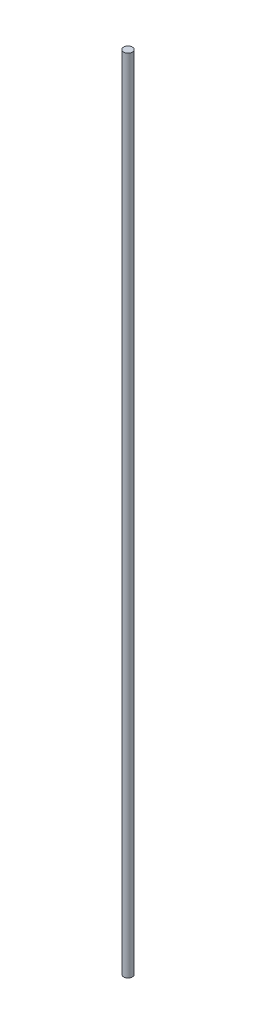
ISO-10303-21;
HEADER;
FILE_DESCRIPTION(('STEP AP214'),'2;1');
FILE_NAME('part.step','',(''),(''),'','','');
FILE_SCHEMA(('AUTOMOTIVE_DESIGN { 1 0 10303 214 1 1 1 1 }'));
ENDSEC;
DATA;
#1=APPLICATION_CONTEXT('core data for automotive mechanical design processes');
#2=APPLICATION_PROTOCOL_DEFINITION('international standard','automotive_design',2000,#1);
#3=PRODUCT_CONTEXT('',#1,'mechanical');
#4=PRODUCT('Part','Part','',(#3));
#5=PRODUCT_RELATED_PRODUCT_CATEGORY('part','',(#4));
#6=PRODUCT_DEFINITION_FORMATION('','',#4);
#7=PRODUCT_DEFINITION_CONTEXT('part definition',#1,'design');
#8=PRODUCT_DEFINITION('design','',#6,#7);
#9=PRODUCT_DEFINITION_SHAPE('','',#8);
#10=(LENGTH_UNIT() NAMED_UNIT(*) SI_UNIT(.MILLI.,.METRE.));
#11=(NAMED_UNIT(*) PLANE_ANGLE_UNIT() SI_UNIT($,.RADIAN.));
#12=(NAMED_UNIT(*) SI_UNIT($,.STERADIAN.) SOLID_ANGLE_UNIT());
#13=UNCERTAINTY_MEASURE_WITH_UNIT(LENGTH_MEASURE(1.E-05),#10,'distance_accuracy_value','');
#14=(GEOMETRIC_REPRESENTATION_CONTEXT(3) GLOBAL_UNCERTAINTY_ASSIGNED_CONTEXT((#13)) GLOBAL_UNIT_ASSIGNED_CONTEXT((#10,
#11,#12)) REPRESENTATION_CONTEXT('',''));
#15=CARTESIAN_POINT('',(0.,0.,0.));
#16=DIRECTION('',(0.,0.,1.));
#17=DIRECTION('',(1.,0.,0.));
#18=AXIS2_PLACEMENT_3D('',#15,#16,#17);
#19=CARTESIAN_POINT('',(0.,730.,0.));
#20=DIRECTION('',(0.,-1.,0.));
#21=DIRECTION('',(0.,0.,-1.));
#22=AXIS2_PLACEMENT_3D('',#19,#20,#21);
#23=CYLINDRICAL_SURFACE('',#22,4.);
#24=CARTESIAN_POINT('',(0.,730.,0.));
#25=DIRECTION('',(0.,1.,0.));
#26=DIRECTION('',(0.,0.,1.));
#27=AXIS2_PLACEMENT_3D('',#24,#25,#26);
#28=CIRCLE('',#27,4.);
#29=CARTESIAN_POINT('',(0.,730.,-4.));
#30=VERTEX_POINT('',#29);
#31=EDGE_CURVE('E10',#30,#30,#28,.T.);
#32=CARTESIAN_POINT('',(0.,0.,0.));
#33=DIRECTION('',(0.,1.,0.));
#34=DIRECTION('',(0.,0.,1.));
#35=AXIS2_PLACEMENT_3D('',#32,#33,#34);
#36=CIRCLE('',#35,4.);
#37=CARTESIAN_POINT('',(0.,-1.11022302462516E-13,-4.));
#38=VERTEX_POINT('',#37);
#39=EDGE_CURVE('E33',#38,#38,#36,.T.);
#40=CARTESIAN_POINT('',(0.,730.,-4.));
#41=CARTESIAN_POINT('',(0.,722.395833333333,-4.));
#42=CARTESIAN_POINT('',(0.,714.791666666667,-4.));
#43=CARTESIAN_POINT('',(0.,699.583333333333,-4.));
#44=CARTESIAN_POINT('',(0.,691.979166666667,-4.));
#45=CARTESIAN_POINT('',(0.,676.770833333333,-4.));
#46=CARTESIAN_POINT('',(0.,669.166666666667,-4.));
#47=CARTESIAN_POINT('',(0.,653.958333333333,-4.));
#48=CARTESIAN_POINT('',(0.,646.354166666667,-4.));
#49=CARTESIAN_POINT('',(0.,631.145833333333,-4.));
#50=CARTESIAN_POINT('',(0.,623.541666666667,-4.));
#51=CARTESIAN_POINT('',(0.,608.333333333333,-4.));
#52=CARTESIAN_POINT('',(0.,600.729166666667,-4.));
#53=CARTESIAN_POINT('',(0.,585.520833333333,-4.));
#54=CARTESIAN_POINT('',(0.,577.916666666667,-4.));
#55=CARTESIAN_POINT('',(0.,562.708333333333,-4.));
#56=CARTESIAN_POINT('',(0.,555.104166666667,-4.));
#57=CARTESIAN_POINT('',(0.,539.895833333333,-4.));
#58=CARTESIAN_POINT('',(0.,532.291666666667,-4.));
#59=CARTESIAN_POINT('',(0.,517.083333333333,-4.));
#60=CARTESIAN_POINT('',(0.,509.479166666667,-4.));
#61=CARTESIAN_POINT('',(0.,494.270833333333,-4.));
#62=CARTESIAN_POINT('',(0.,486.666666666667,-4.));
#63=CARTESIAN_POINT('',(0.,471.458333333333,-4.));
#64=CARTESIAN_POINT('',(0.,463.854166666667,-4.));
#65=CARTESIAN_POINT('',(0.,448.645833333333,-4.));
#66=CARTESIAN_POINT('',(0.,441.041666666667,-4.));
#67=CARTESIAN_POINT('',(0.,425.833333333333,-4.));
#68=CARTESIAN_POINT('',(0.,418.229166666667,-4.));
#69=CARTESIAN_POINT('',(0.,403.020833333333,-4.));
#70=CARTESIAN_POINT('',(0.,395.416666666667,-4.));
#71=CARTESIAN_POINT('',(0.,380.208333333333,-4.));
#72=CARTESIAN_POINT('',(0.,372.604166666667,-4.));
#73=CARTESIAN_POINT('',(0.,357.395833333333,-4.));
#74=CARTESIAN_POINT('',(0.,349.791666666667,-4.));
#75=CARTESIAN_POINT('',(0.,334.583333333333,-4.));
#76=CARTESIAN_POINT('',(0.,326.979166666667,-4.));
#77=CARTESIAN_POINT('',(0.,311.770833333333,-4.));
#78=CARTESIAN_POINT('',(0.,304.166666666667,-4.));
#79=CARTESIAN_POINT('',(0.,288.958333333333,-4.));
#80=CARTESIAN_POINT('',(0.,281.354166666667,-4.));
#81=CARTESIAN_POINT('',(0.,266.145833333333,-4.));
#82=CARTESIAN_POINT('',(0.,258.541666666667,-4.));
#83=CARTESIAN_POINT('',(0.,243.333333333333,-4.));
#84=CARTESIAN_POINT('',(0.,235.729166666667,-4.));
#85=CARTESIAN_POINT('',(0.,220.520833333333,-4.));
#86=CARTESIAN_POINT('',(0.,212.916666666667,-4.));
#87=CARTESIAN_POINT('',(0.,197.708333333333,-4.));
#88=CARTESIAN_POINT('',(0.,190.104166666667,-4.));
#89=CARTESIAN_POINT('',(0.,174.895833333333,-4.));
#90=CARTESIAN_POINT('',(0.,167.291666666667,-4.));
#91=CARTESIAN_POINT('',(0.,152.083333333333,-4.));
#92=CARTESIAN_POINT('',(0.,144.479166666667,-4.));
#93=CARTESIAN_POINT('',(0.,129.270833333333,-4.));
#94=CARTESIAN_POINT('',(0.,121.666666666667,-4.));
#95=CARTESIAN_POINT('',(0.,106.458333333333,-4.));
#96=CARTESIAN_POINT('',(0.,98.8541666666666,-4.));
#97=CARTESIAN_POINT('',(0.,83.6458333333333,-4.));
#98=CARTESIAN_POINT('',(0.,76.0416666666666,-4.));
#99=CARTESIAN_POINT('',(0.,60.8333333333333,-4.));
#100=CARTESIAN_POINT('',(0.,53.2291666666666,-4.));
#101=CARTESIAN_POINT('',(0.,38.0208333333332,-4.));
#102=CARTESIAN_POINT('',(0.,30.4166666666666,-4.));
#103=CARTESIAN_POINT('',(0.,15.2083333333332,-4.));
#104=CARTESIAN_POINT('',(0.,7.60416666666656,-4.));
#105=CARTESIAN_POINT('',(0.,-1.11022302462516E-13,-4.));
#106=B_SPLINE_CURVE_WITH_KNOTS('',3,(#40,#41,#42,#43,#44,#45,#46,#47,#48,#49,#50,#51,#52,#53,
#54,#55,#56,#57,#58,#59,#60,#61,#62,#63,#64,#65,#66,#67,#68,#69,#70,#71,#72,#73,#74,#75,#76,#77,
#78,#79,#80,#81,#82,#83,#84,#85,#86,#87,#88,#89,#90,#91,#92,#93,#94,#95,#96,#97,#98,#99,#100,
#101,#102,#103,#104,#105),.UNSPECIFIED.,.F.,.F.,(4,2,2,2,2,2,2,2,2,2,2,2,2,2,2,2,2,2,2,2,2,2,2,
2,2,2,2,2,2,2,2,2,4),(0.,22.8124999999999,45.6249999999999,68.4374999999999,91.2499999999999,
114.0625,136.875,159.6875,182.5,205.3125,228.125,250.9375,273.75,296.5625,319.375,342.1875,365.,
387.8125,410.625,433.4375,456.25,479.0625,501.875,524.6875,547.5,570.3125,593.125,615.9375,
638.75,661.5625,684.375,707.1875,730.),.UNSPECIFIED.);
#107=EDGE_CURVE('BSEAM30',#30,#38,#106,.T.);
#108=ORIENTED_EDGE('',*,*,#31,.F.);
#109=ORIENTED_EDGE('',*,*,#39,.T.);
#110=ORIENTED_EDGE('',*,*,#107,.T.);
#111=ORIENTED_EDGE('',*,*,#107,.F.);
#112=EDGE_LOOP('',(#108,#110,#109,#111));
#113=FACE_BOUND('',#112,.T.);
#114=ADVANCED_FACE('F30',(#113),#23,.T.);
#115=CARTESIAN_POINT('',(0.,730.,0.));
#116=DIRECTION('',(0.,1.,0.));
#117=DIRECTION('',(0.,0.,1.));
#118=AXIS2_PLACEMENT_3D('',#115,#116,#117);
#119=PLANE('',#118);
#120=ORIENTED_EDGE('',*,*,#31,.T.);
#121=EDGE_LOOP('',(#120));
#122=FACE_BOUND('',#121,.T.);
#123=ADVANCED_FACE('F45',(#122),#119,.T.);
#124=CARTESIAN_POINT('',(0.,0.,0.));
#125=DIRECTION('',(0.,1.,0.));
#126=DIRECTION('',(0.,0.,1.));
#127=AXIS2_PLACEMENT_3D('',#124,#125,#126);
#128=PLANE('',#127);
#129=ORIENTED_EDGE('',*,*,#39,.F.);
#130=EDGE_LOOP('',(#129));
#131=FACE_BOUND('',#130,.T.);
#132=ADVANCED_FACE('F43',(#131),#128,.F.);
#133=CLOSED_SHELL('',(#114,#123,#132));
#134=MANIFOLD_SOLID_BREP('B2',#133);
#135=ADVANCED_BREP_SHAPE_REPRESENTATION('',(#18,#134),#14);
#136=SHAPE_DEFINITION_REPRESENTATION(#9,#135);
ENDSEC;
END-ISO-10303-21;
